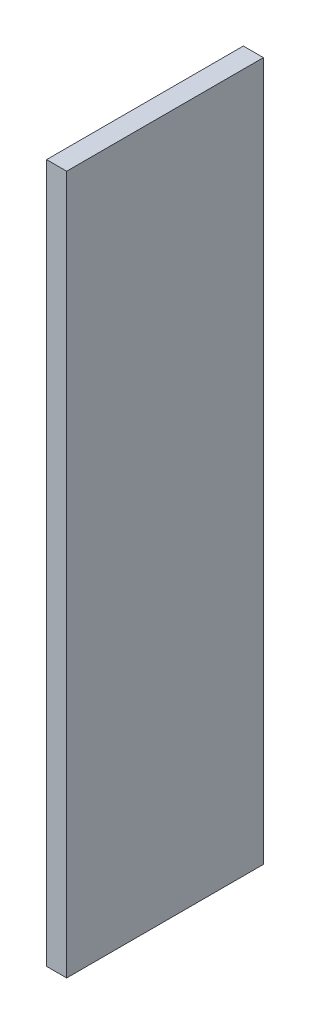
ISO-10303-21;
HEADER;
FILE_DESCRIPTION(('STEP AP214'),'2;1');
FILE_NAME('part.step','',(''),(''),'','','');
FILE_SCHEMA(('AUTOMOTIVE_DESIGN { 1 0 10303 214 1 1 1 1 }'));
ENDSEC;
DATA;
#1=APPLICATION_CONTEXT('core data for automotive mechanical design processes');
#2=APPLICATION_PROTOCOL_DEFINITION('international standard','automotive_design',2000,#1);
#3=PRODUCT_CONTEXT('',#1,'mechanical');
#4=PRODUCT('Part','Part','',(#3));
#5=PRODUCT_RELATED_PRODUCT_CATEGORY('part','',(#4));
#6=PRODUCT_DEFINITION_FORMATION('','',#4);
#7=PRODUCT_DEFINITION_CONTEXT('part definition',#1,'design');
#8=PRODUCT_DEFINITION('design','',#6,#7);
#9=PRODUCT_DEFINITION_SHAPE('','',#8);
#10=(LENGTH_UNIT() NAMED_UNIT(*) SI_UNIT(.MILLI.,.METRE.));
#11=(NAMED_UNIT(*) PLANE_ANGLE_UNIT() SI_UNIT($,.RADIAN.));
#12=(NAMED_UNIT(*) SI_UNIT($,.STERADIAN.) SOLID_ANGLE_UNIT());
#13=UNCERTAINTY_MEASURE_WITH_UNIT(LENGTH_MEASURE(1.E-05),#10,'distance_accuracy_value','');
#14=(GEOMETRIC_REPRESENTATION_CONTEXT(3) GLOBAL_UNCERTAINTY_ASSIGNED_CONTEXT((#13)) GLOBAL_UNIT_ASSIGNED_CONTEXT((#10,
#11,#12)) REPRESENTATION_CONTEXT('',''));
#15=CARTESIAN_POINT('',(0.,0.,0.));
#16=DIRECTION('',(0.,0.,1.));
#17=DIRECTION('',(1.,0.,0.));
#18=AXIS2_PLACEMENT_3D('',#15,#16,#17);
#19=CARTESIAN_POINT('',(1.85767806868369,-0.87,0.24));
#20=DIRECTION('',(0.,0.,1.));
#21=DIRECTION('',(1.,0.,0.));
#22=AXIS2_PLACEMENT_3D('',#19,#20,#21);
#23=PLANE('',#22);
#24=DIRECTION('',(0.,-1.,0.));
#25=VECTOR('',#24,1.);
#26=CARTESIAN_POINT('',(0.0499999999999999,-0.87,0.24));
#27=LINE('',#26,#25);
#28=CARTESIAN_POINT('',(0.0499999999999999,0.87,0.24));
#29=VERTEX_POINT('',#28);
#30=CARTESIAN_POINT('',(0.0499999999999999,-0.87,0.24));
#31=VERTEX_POINT('',#30);
#32=EDGE_CURVE('E41',#29,#31,#27,.T.);
#33=ORIENTED_EDGE('',*,*,#32,.F.);
#34=DIRECTION('',(-1.,0.,0.));
#35=VECTOR('',#34,1.);
#36=CARTESIAN_POINT('',(1.85767806868369,0.87,0.24));
#37=LINE('',#36,#35);
#38=CARTESIAN_POINT('',(0.,0.87,0.24));
#39=VERTEX_POINT('',#38);
#40=EDGE_CURVE('E69',#29,#39,#37,.T.);
#41=ORIENTED_EDGE('',*,*,#40,.T.);
#42=DIRECTION('',(0.,1.,0.));
#43=VECTOR('',#42,1.);
#44=CARTESIAN_POINT('',(0.,-0.87,0.24));
#45=LINE('',#44,#43);
#46=CARTESIAN_POINT('',(0.,-0.87,0.24));
#47=VERTEX_POINT('',#46);
#48=EDGE_CURVE('E73',#47,#39,#45,.T.);
#49=ORIENTED_EDGE('',*,*,#48,.F.);
#50=DIRECTION('',(-1.,0.,0.));
#51=VECTOR('',#50,1.);
#52=CARTESIAN_POINT('',(1.85767806868369,-0.87,0.24));
#53=LINE('',#52,#51);
#54=EDGE_CURVE('E96',#31,#47,#53,.T.);
#55=ORIENTED_EDGE('',*,*,#54,.F.);
#56=EDGE_LOOP('',(#33,#41,#49,#55));
#57=FACE_BOUND('',#56,.T.);
#58=ADVANCED_FACE('F33',(#57),#23,.T.);
#59=CARTESIAN_POINT('',(1.85767806868369,-0.87,-0.25));
#60=DIRECTION('',(0.,-1.,0.));
#61=DIRECTION('',(0.,0.,-1.));
#62=AXIS2_PLACEMENT_3D('',#59,#60,#61);
#63=PLANE('',#62);
#64=DIRECTION('',(0.,0.,-1.));
#65=VECTOR('',#64,1.);
#66=CARTESIAN_POINT('',(0.0499999999999999,-0.87,-0.25));
#67=LINE('',#66,#65);
#68=CARTESIAN_POINT('',(0.0499999999999999,-0.87,-0.25));
#69=VERTEX_POINT('',#68);
#70=EDGE_CURVE('E47',#31,#69,#67,.T.);
#71=ORIENTED_EDGE('',*,*,#70,.F.);
#72=ORIENTED_EDGE('',*,*,#54,.T.);
#73=DIRECTION('',(0.,0.,1.));
#74=VECTOR('',#73,1.);
#75=CARTESIAN_POINT('',(0.,-0.87,-0.25));
#76=LINE('',#75,#74);
#77=CARTESIAN_POINT('',(0.,-0.87,-0.25));
#78=VERTEX_POINT('',#77);
#79=EDGE_CURVE('E78',#78,#47,#76,.T.);
#80=ORIENTED_EDGE('',*,*,#79,.F.);
#81=DIRECTION('',(-1.,0.,0.));
#82=VECTOR('',#81,1.);
#83=CARTESIAN_POINT('',(1.85767806868369,-0.87,-0.25));
#84=LINE('',#83,#82);
#85=EDGE_CURVE('E99',#69,#78,#84,.T.);
#86=ORIENTED_EDGE('',*,*,#85,.F.);
#87=EDGE_LOOP('',(#71,#72,#80,#86));
#88=FACE_BOUND('',#87,.T.);
#89=ADVANCED_FACE('F105',(#88),#63,.T.);
#90=CARTESIAN_POINT('',(1.85767806868369,0.87,-0.25));
#91=DIRECTION('',(0.,0.,-1.));
#92=DIRECTION('',(0.,1.,0.));
#93=AXIS2_PLACEMENT_3D('',#90,#91,#92);
#94=PLANE('',#93);
#95=DIRECTION('',(0.,1.,0.));
#96=VECTOR('',#95,1.);
#97=CARTESIAN_POINT('',(0.0499999999999999,0.87,-0.25));
#98=LINE('',#97,#96);
#99=CARTESIAN_POINT('',(0.0499999999999999,0.87,-0.25));
#100=VERTEX_POINT('',#99);
#101=EDGE_CURVE('E98',#69,#100,#98,.T.);
#102=ORIENTED_EDGE('',*,*,#101,.F.);
#103=ORIENTED_EDGE('',*,*,#85,.T.);
#104=DIRECTION('',(0.,-1.,0.));
#105=VECTOR('',#104,1.);
#106=CARTESIAN_POINT('',(0.,0.87,-0.25));
#107=LINE('',#106,#105);
#108=CARTESIAN_POINT('',(0.,0.87,-0.25));
#109=VERTEX_POINT('',#108);
#110=EDGE_CURVE('E86',#109,#78,#107,.T.);
#111=ORIENTED_EDGE('',*,*,#110,.F.);
#112=DIRECTION('',(-1.,0.,0.));
#113=VECTOR('',#112,1.);
#114=CARTESIAN_POINT('',(1.85767806868369,0.87,-0.25));
#115=LINE('',#114,#113);
#116=EDGE_CURVE('E77',#100,#109,#115,.T.);
#117=ORIENTED_EDGE('',*,*,#116,.F.);
#118=EDGE_LOOP('',(#102,#103,#111,#117));
#119=FACE_BOUND('',#118,.T.);
#120=ADVANCED_FACE('F103',(#119),#94,.T.);
#121=CARTESIAN_POINT('',(1.85767806868369,0.87,0.24));
#122=DIRECTION('',(0.,1.,0.));
#123=DIRECTION('',(0.,0.,1.));
#124=AXIS2_PLACEMENT_3D('',#121,#122,#123);
#125=PLANE('',#124);
#126=DIRECTION('',(0.,0.,1.));
#127=VECTOR('',#126,1.);
#128=CARTESIAN_POINT('',(0.0499999999999999,0.87,0.24));
#129=LINE('',#128,#127);
#130=EDGE_CURVE('E11',#100,#29,#129,.T.);
#131=ORIENTED_EDGE('',*,*,#130,.F.);
#132=ORIENTED_EDGE('',*,*,#116,.T.);
#133=DIRECTION('',(0.,0.,-1.));
#134=VECTOR('',#133,1.);
#135=CARTESIAN_POINT('',(0.,0.87,0.24));
#136=LINE('',#135,#134);
#137=EDGE_CURVE('E80',#39,#109,#136,.T.);
#138=ORIENTED_EDGE('',*,*,#137,.F.);
#139=ORIENTED_EDGE('',*,*,#40,.F.);
#140=EDGE_LOOP('',(#131,#132,#138,#139));
#141=FACE_BOUND('',#140,.T.);
#142=ADVANCED_FACE('F81',(#141),#125,.T.);
#143=CARTESIAN_POINT('',(0.,0.,0.));
#144=DIRECTION('',(-1.,0.,0.));
#145=DIRECTION('',(0.,0.,1.));
#146=AXIS2_PLACEMENT_3D('',#143,#144,#145);
#147=PLANE('',#146);
#148=ORIENTED_EDGE('',*,*,#48,.T.);
#149=ORIENTED_EDGE('',*,*,#137,.T.);
#150=ORIENTED_EDGE('',*,*,#110,.T.);
#151=ORIENTED_EDGE('',*,*,#79,.T.);
#152=EDGE_LOOP('',(#148,#149,#150,#151));
#153=FACE_BOUND('',#152,.T.);
#154=ADVANCED_FACE('F88',(#153),#147,.T.);
#155=CARTESIAN_POINT('',(0.05,0.832,1.41968162443208));
#156=DIRECTION('',(-1.,0.,0.));
#157=DIRECTION('',(0.,0.,1.));
#158=AXIS2_PLACEMENT_3D('',#155,#156,#157);
#159=PLANE('',#158);
#160=ORIENTED_EDGE('',*,*,#32,.T.);
#161=ORIENTED_EDGE('',*,*,#70,.T.);
#162=ORIENTED_EDGE('',*,*,#101,.T.);
#163=ORIENTED_EDGE('',*,*,#130,.T.);
#164=EDGE_LOOP('',(#160,#161,#162,#163));
#165=FACE_BOUND('',#164,.T.);
#166=ADVANCED_FACE('F107',(#165),#159,.F.);
#167=CLOSED_SHELL('',(#58,#89,#120,#142,#154,#166));
#168=MANIFOLD_SOLID_BREP('B2',#167);
#169=ADVANCED_BREP_SHAPE_REPRESENTATION('',(#18,#168),#14);
#170=SHAPE_DEFINITION_REPRESENTATION(#9,#169);
ENDSEC;
END-ISO-10303-21;
